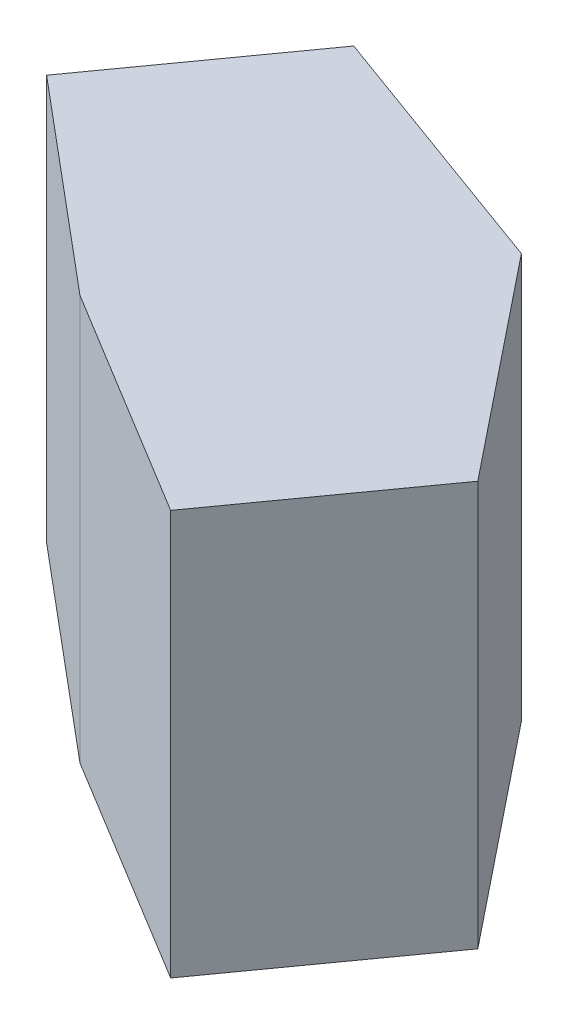
ISO-10303-21;
HEADER;
FILE_DESCRIPTION(('STEP AP214'),'2;1');
FILE_NAME('part.step','',(''),(''),'','','');
FILE_SCHEMA(('AUTOMOTIVE_DESIGN { 1 0 10303 214 1 1 1 1 }'));
ENDSEC;
DATA;
#1=APPLICATION_CONTEXT('core data for automotive mechanical design processes');
#2=APPLICATION_PROTOCOL_DEFINITION('international standard','automotive_design',2000,#1);
#3=PRODUCT_CONTEXT('',#1,'mechanical');
#4=PRODUCT('Part','Part','',(#3));
#5=PRODUCT_RELATED_PRODUCT_CATEGORY('part','',(#4));
#6=PRODUCT_DEFINITION_FORMATION('','',#4);
#7=PRODUCT_DEFINITION_CONTEXT('part definition',#1,'design');
#8=PRODUCT_DEFINITION('design','',#6,#7);
#9=PRODUCT_DEFINITION_SHAPE('','',#8);
#10=(LENGTH_UNIT() NAMED_UNIT(*) SI_UNIT(.MILLI.,.METRE.));
#11=(NAMED_UNIT(*) PLANE_ANGLE_UNIT() SI_UNIT($,.RADIAN.));
#12=(NAMED_UNIT(*) SI_UNIT($,.STERADIAN.) SOLID_ANGLE_UNIT());
#13=UNCERTAINTY_MEASURE_WITH_UNIT(LENGTH_MEASURE(1.E-05),#10,'distance_accuracy_value','');
#14=(GEOMETRIC_REPRESENTATION_CONTEXT(3) GLOBAL_UNCERTAINTY_ASSIGNED_CONTEXT((#13)) GLOBAL_UNIT_ASSIGNED_CONTEXT((#10,
#11,#12)) REPRESENTATION_CONTEXT('',''));
#15=CARTESIAN_POINT('',(0.,0.,0.));
#16=DIRECTION('',(0.,0.,1.));
#17=DIRECTION('',(1.,0.,0.));
#18=AXIS2_PLACEMENT_3D('',#15,#16,#17);
#19=CARTESIAN_POINT('',(21.8993873841182,6.5,18.375767877022));
#20=DIRECTION('',(0.64278760968654,0.,-0.766044443118977));
#21=DIRECTION('',(-0.766044443118977,0.,-0.64278760968654));
#22=AXIS2_PLACEMENT_3D('',#19,#20,#21);
#23=PLANE('',#22);
#24=DIRECTION('',(0.766044443118977,0.,0.64278760968654));
#25=VECTOR('',#24,1.);
#26=CARTESIAN_POINT('',(21.8993873841182,-6.5,18.375767877022));
#27=LINE('',#26,#25);
#28=CARTESIAN_POINT('',(15.238834477124,-6.5,12.7869003893264));
#29=VERTEX_POINT('',#28);
#30=CARTESIAN_POINT('',(21.8993873841182,-6.5,18.375767877022));
#31=VERTEX_POINT('',#30);
#32=EDGE_CURVE('E134',#29,#31,#27,.T.);
#33=ORIENTED_EDGE('',*,*,#32,.T.);
#34=DIRECTION('',(0.,-1.,0.));
#35=VECTOR('',#34,1.);
#36=CARTESIAN_POINT('',(21.8993873841182,6.5,18.375767877022));
#37=LINE('',#36,#35);
#38=CARTESIAN_POINT('',(21.8993873841182,6.5,18.375767877022));
#39=VERTEX_POINT('',#38);
#40=EDGE_CURVE('E131',#39,#31,#37,.T.);
#41=ORIENTED_EDGE('',*,*,#40,.F.);
#42=DIRECTION('',(0.766044443118977,0.,0.64278760968654));
#43=VECTOR('',#42,1.);
#44=CARTESIAN_POINT('',(21.8993873841182,6.5,18.375767877022));
#45=LINE('',#44,#43);
#46=CARTESIAN_POINT('',(15.238834477124,6.5,12.7869003893264));
#47=VERTEX_POINT('',#46);
#48=EDGE_CURVE('E79',#47,#39,#45,.T.);
#49=ORIENTED_EDGE('',*,*,#48,.F.);
#50=DIRECTION('',(0.,-1.,0.));
#51=VECTOR('',#50,1.);
#52=CARTESIAN_POINT('',(15.238834477124,6.5,12.7869003893264));
#53=LINE('',#52,#51);
#54=EDGE_CURVE('E47',#47,#29,#53,.T.);
#55=ORIENTED_EDGE('',*,*,#54,.T.);
#56=EDGE_LOOP('',(#33,#41,#49,#55));
#57=FACE_BOUND('',#56,.T.);
#58=ADVANCED_FACE('F39',(#57),#23,.F.);
#59=CARTESIAN_POINT('',(19.3571955222303,6.5,7.04544298896284));
#60=DIRECTION('',(-0.342020143325669,0.,0.939692620785908));
#61=DIRECTION('',(0.939692620785908,0.,0.342020143325669));
#62=AXIS2_PLACEMENT_3D('',#59,#60,#61);
#63=PLANE('',#62);
#64=DIRECTION('',(-0.939692620785908,0.,-0.342020143325669));
#65=VECTOR('',#64,1.);
#66=CARTESIAN_POINT('',(19.3571955222303,-6.5,7.04544298896284));
#67=LINE('',#66,#65);
#68=CARTESIAN_POINT('',(27.8183314016147,-6.5,10.1250445971406));
#69=VERTEX_POINT('',#68);
#70=CARTESIAN_POINT('',(19.3571955222303,-6.5,7.04544298896284));
#71=VERTEX_POINT('',#70);
#72=EDGE_CURVE('E69',#69,#71,#67,.T.);
#73=ORIENTED_EDGE('',*,*,#72,.T.);
#74=DIRECTION('',(0.,-1.,0.));
#75=VECTOR('',#74,1.);
#76=CARTESIAN_POINT('',(19.3571955222303,6.5,7.04544298896284));
#77=LINE('',#76,#75);
#78=CARTESIAN_POINT('',(19.3571955222303,6.5,7.04544298896284));
#79=VERTEX_POINT('',#78);
#80=EDGE_CURVE('E11',#79,#71,#77,.T.);
#81=ORIENTED_EDGE('',*,*,#80,.F.);
#82=DIRECTION('',(-0.939692620785908,0.,-0.342020143325669));
#83=VECTOR('',#82,1.);
#84=CARTESIAN_POINT('',(19.3571955222303,6.5,7.04544298896284));
#85=LINE('',#84,#83);
#86=CARTESIAN_POINT('',(27.8183314016147,6.5,10.1250445971406));
#87=VERTEX_POINT('',#86);
#88=EDGE_CURVE('E136',#87,#79,#85,.T.);
#89=ORIENTED_EDGE('',*,*,#88,.F.);
#90=DIRECTION('',(0.,-1.,0.));
#91=VECTOR('',#90,1.);
#92=CARTESIAN_POINT('',(27.8183314016147,6.5,10.1250445971406));
#93=LINE('',#92,#91);
#94=EDGE_CURVE('E117',#87,#69,#93,.T.);
#95=ORIENTED_EDGE('',*,*,#94,.T.);
#96=EDGE_LOOP('',(#73,#81,#89,#95));
#97=FACE_BOUND('',#96,.T.);
#98=ADVANCED_FACE('F159',(#97),#63,.F.);
#99=CARTESIAN_POINT('',(15.238834477124,6.5,12.7869003893264));
#100=DIRECTION('',(0.812572473756379,0.,0.582860167530291));
#101=DIRECTION('',(0.582860167530291,0.,-0.812572473756379));
#102=AXIS2_PLACEMENT_3D('',#99,#100,#101);
#103=PLANE('',#102);
#104=DIRECTION('',(-0.582860167530291,0.,0.812572473756379));
#105=VECTOR('',#104,1.);
#106=CARTESIAN_POINT('',(15.238834477124,-6.5,12.7869003893264));
#107=LINE('',#106,#105);
#108=EDGE_CURVE('E74',#71,#29,#107,.T.);
#109=ORIENTED_EDGE('',*,*,#108,.T.);
#110=ORIENTED_EDGE('',*,*,#54,.F.);
#111=DIRECTION('',(-0.582860167530291,0.,0.812572473756379));
#112=VECTOR('',#111,1.);
#113=CARTESIAN_POINT('',(15.238834477124,6.5,12.7869003893264));
#114=LINE('',#113,#112);
#115=EDGE_CURVE('E55',#79,#47,#114,.T.);
#116=ORIENTED_EDGE('',*,*,#115,.F.);
#117=ORIENTED_EDGE('',*,*,#80,.T.);
#118=EDGE_LOOP('',(#109,#110,#116,#117));
#119=FACE_BOUND('',#118,.T.);
#120=ADVANCED_FACE('F164',(#119),#103,.F.);
#121=CARTESIAN_POINT('',(0.,6.5,0.));
#122=DIRECTION('',(0.,1.,0.));
#123=DIRECTION('',(0.,0.,1.));
#124=AXIS2_PLACEMENT_3D('',#121,#122,#123);
#125=PLANE('',#124);
#126=ORIENTED_EDGE('',*,*,#48,.T.);
#127=DIRECTION('',(-0.854366609972129,0.,-0.519670757080608));
#128=VECTOR('',#127,1.);
#129=CARTESIAN_POINT('',(21.8993873841182,6.5,18.375767877022));
#130=LINE('',#129,#128);
#131=CARTESIAN_POINT('',(29.3278780660941,6.5,22.8941670415149));
#132=VERTEX_POINT('',#131);
#133=EDGE_CURVE('E104',#132,#39,#130,.T.);
#134=ORIENTED_EDGE('',*,*,#133,.F.);
#135=DIRECTION('',(-0.582948674258607,0.,0.812508980368915));
#136=VECTOR('',#135,1.);
#137=CARTESIAN_POINT('',(29.3278780660941,6.5,22.8941670415149));
#138=LINE('',#137,#136);
#139=CARTESIAN_POINT('',(33.4468644801695,6.5,17.1531582713857));
#140=VERTEX_POINT('',#139);
#141=EDGE_CURVE('E97',#140,#132,#138,.T.);
#142=ORIENTED_EDGE('',*,*,#141,.F.);
#143=DIRECTION('',(0.625104132017813,0.,0.780541366062207));
#144=VECTOR('',#143,1.);
#145=CARTESIAN_POINT('',(33.4468644801695,6.5,17.1531582713857));
#146=LINE('',#145,#144);
#147=EDGE_CURVE('E101',#87,#140,#146,.T.);
#148=ORIENTED_EDGE('',*,*,#147,.F.);
#149=ORIENTED_EDGE('',*,*,#88,.T.);
#150=ORIENTED_EDGE('',*,*,#115,.T.);
#151=EDGE_LOOP('',(#126,#134,#142,#148,#149,#150));
#152=FACE_BOUND('',#151,.T.);
#153=ADVANCED_FACE('F99',(#152),#125,.T.);
#154=CARTESIAN_POINT('',(0.,-6.5,0.));
#155=DIRECTION('',(0.,1.,0.));
#156=DIRECTION('',(0.,0.,1.));
#157=AXIS2_PLACEMENT_3D('',#154,#155,#156);
#158=PLANE('',#157);
#159=ORIENTED_EDGE('',*,*,#32,.F.);
#160=ORIENTED_EDGE('',*,*,#108,.F.);
#161=ORIENTED_EDGE('',*,*,#72,.F.);
#162=DIRECTION('',(0.625104132017813,0.,0.780541366062207));
#163=VECTOR('',#162,1.);
#164=CARTESIAN_POINT('',(33.4468644801695,-6.5,17.1531582713857));
#165=LINE('',#164,#163);
#166=CARTESIAN_POINT('',(33.4468644801695,-6.5,17.1531582713857));
#167=VERTEX_POINT('',#166);
#168=EDGE_CURVE('E126',#69,#167,#165,.T.);
#169=ORIENTED_EDGE('',*,*,#168,.T.);
#170=DIRECTION('',(-0.582948674258607,0.,0.812508980368915));
#171=VECTOR('',#170,1.);
#172=CARTESIAN_POINT('',(29.3278780660941,-6.5,22.8941670415149));
#173=LINE('',#172,#171);
#174=CARTESIAN_POINT('',(29.3278780660941,-6.5,22.8941670415149));
#175=VERTEX_POINT('',#174);
#176=EDGE_CURVE('E113',#167,#175,#173,.T.);
#177=ORIENTED_EDGE('',*,*,#176,.T.);
#178=DIRECTION('',(-0.854366609972129,0.,-0.519670757080608));
#179=VECTOR('',#178,1.);
#180=CARTESIAN_POINT('',(21.8993873841182,-6.5,18.375767877022));
#181=LINE('',#180,#179);
#182=EDGE_CURVE('E123',#175,#31,#181,.T.);
#183=ORIENTED_EDGE('',*,*,#182,.T.);
#184=EDGE_LOOP('',(#159,#160,#161,#169,#177,#183));
#185=FACE_BOUND('',#184,.T.);
#186=ADVANCED_FACE('F144',(#185),#158,.F.);
#187=CARTESIAN_POINT('',(21.8993873841182,6.5,18.375767877022));
#188=DIRECTION('',(0.519670757080608,0.,-0.854366609972129));
#189=DIRECTION('',(0.854366609972129,0.,0.519670757080608));
#190=AXIS2_PLACEMENT_3D('',#187,#188,#189);
#191=PLANE('',#190);
#192=ORIENTED_EDGE('',*,*,#182,.F.);
#193=DIRECTION('',(0.,-1.,0.));
#194=VECTOR('',#193,1.);
#195=CARTESIAN_POINT('',(29.3278780660941,6.5,22.8941670415149));
#196=LINE('',#195,#194);
#197=EDGE_CURVE('E108',#132,#175,#196,.T.);
#198=ORIENTED_EDGE('',*,*,#197,.F.);
#199=ORIENTED_EDGE('',*,*,#133,.T.);
#200=ORIENTED_EDGE('',*,*,#40,.T.);
#201=EDGE_LOOP('',(#192,#198,#199,#200));
#202=FACE_BOUND('',#201,.T.);
#203=ADVANCED_FACE('F147',(#202),#191,.F.);
#204=CARTESIAN_POINT('',(33.4468644801695,6.5,17.1531582713857));
#205=DIRECTION('',(-0.780541366062207,0.,0.625104132017814));
#206=DIRECTION('',(-0.625104132017813,0.,-0.780541366062207));
#207=AXIS2_PLACEMENT_3D('',#204,#205,#206);
#208=PLANE('',#207);
#209=ORIENTED_EDGE('',*,*,#168,.F.);
#210=ORIENTED_EDGE('',*,*,#94,.F.);
#211=ORIENTED_EDGE('',*,*,#147,.T.);
#212=DIRECTION('',(0.,-1.,0.));
#213=VECTOR('',#212,1.);
#214=CARTESIAN_POINT('',(33.4468644801695,6.5,17.1531582713857));
#215=LINE('',#214,#213);
#216=EDGE_CURVE('E111',#140,#167,#215,.T.);
#217=ORIENTED_EDGE('',*,*,#216,.T.);
#218=EDGE_LOOP('',(#209,#210,#211,#217));
#219=FACE_BOUND('',#218,.T.);
#220=ADVANCED_FACE('F119',(#219),#208,.F.);
#221=CARTESIAN_POINT('',(29.3278780660941,6.5,22.8941670415149));
#222=DIRECTION('',(-0.812508980368915,0.,-0.582948674258606));
#223=DIRECTION('',(0.582948674258607,0.,-0.812508980368915));
#224=AXIS2_PLACEMENT_3D('',#221,#222,#223);
#225=PLANE('',#224);
#226=ORIENTED_EDGE('',*,*,#176,.F.);
#227=ORIENTED_EDGE('',*,*,#216,.F.);
#228=ORIENTED_EDGE('',*,*,#141,.T.);
#229=ORIENTED_EDGE('',*,*,#197,.T.);
#230=EDGE_LOOP('',(#226,#227,#228,#229));
#231=FACE_BOUND('',#230,.T.);
#232=ADVANCED_FACE('F112',(#231),#225,.F.);
#233=CLOSED_SHELL('',(#58,#98,#120,#153,#186,#203,#220,#232));
#234=MANIFOLD_SOLID_BREP('B2',#233);
#235=ADVANCED_BREP_SHAPE_REPRESENTATION('',(#18,#234),#14);
#236=SHAPE_DEFINITION_REPRESENTATION(#9,#235);
ENDSEC;
END-ISO-10303-21;
